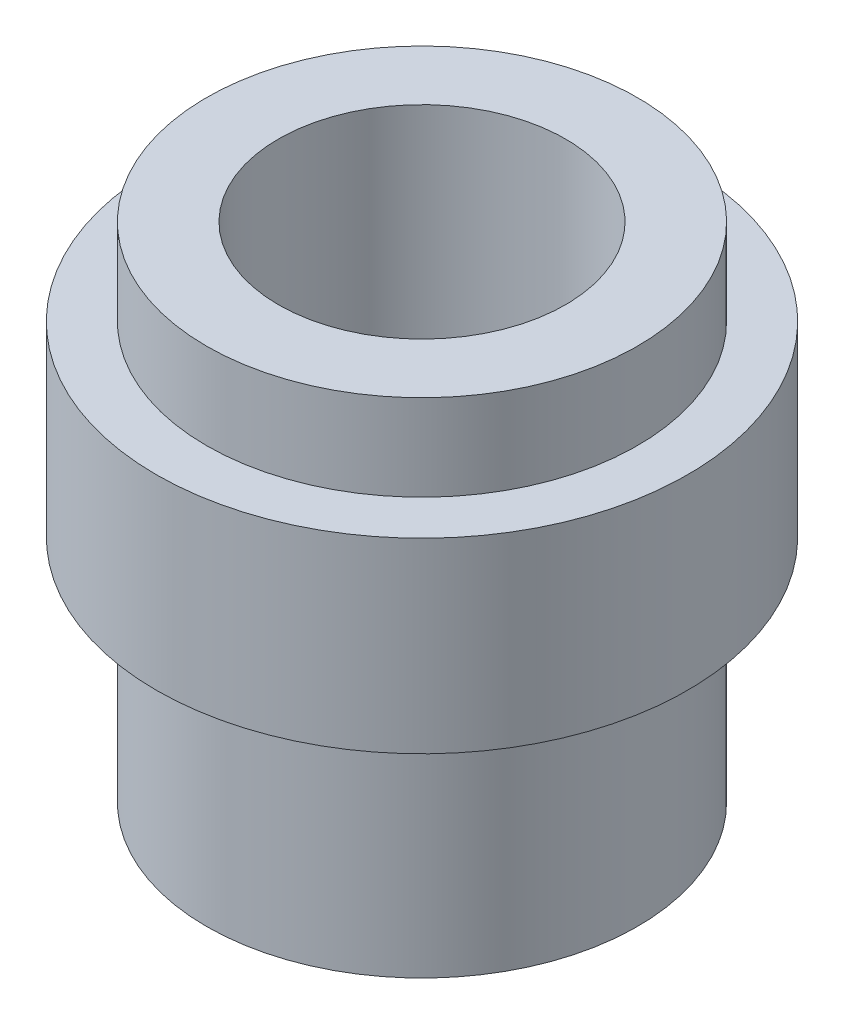
ISO-10303-21;
HEADER;
FILE_DESCRIPTION(('STEP AP214'),'2;1');
FILE_NAME('part.step','',(''),(''),'','','');
FILE_SCHEMA(('AUTOMOTIVE_DESIGN { 1 0 10303 214 1 1 1 1 }'));
ENDSEC;
DATA;
#1=APPLICATION_CONTEXT('core data for automotive mechanical design processes');
#2=APPLICATION_PROTOCOL_DEFINITION('international standard','automotive_design',2000,#1);
#3=PRODUCT_CONTEXT('',#1,'mechanical');
#4=PRODUCT('Part','Part','',(#3));
#5=PRODUCT_RELATED_PRODUCT_CATEGORY('part','',(#4));
#6=PRODUCT_DEFINITION_FORMATION('','',#4);
#7=PRODUCT_DEFINITION_CONTEXT('part definition',#1,'design');
#8=PRODUCT_DEFINITION('design','',#6,#7);
#9=PRODUCT_DEFINITION_SHAPE('','',#8);
#10=(LENGTH_UNIT() NAMED_UNIT(*) SI_UNIT(.MILLI.,.METRE.));
#11=(NAMED_UNIT(*) PLANE_ANGLE_UNIT() SI_UNIT($,.RADIAN.));
#12=(NAMED_UNIT(*) SI_UNIT($,.STERADIAN.) SOLID_ANGLE_UNIT());
#13=UNCERTAINTY_MEASURE_WITH_UNIT(LENGTH_MEASURE(1.E-05),#10,'distance_accuracy_value','');
#14=(GEOMETRIC_REPRESENTATION_CONTEXT(3) GLOBAL_UNCERTAINTY_ASSIGNED_CONTEXT((#13)) GLOBAL_UNIT_ASSIGNED_CONTEXT((#10,
#11,#12)) REPRESENTATION_CONTEXT('',''));
#15=CARTESIAN_POINT('',(0.,0.,0.));
#16=DIRECTION('',(0.,0.,1.));
#17=DIRECTION('',(1.,0.,0.));
#18=AXIS2_PLACEMENT_3D('',#15,#16,#17);
#19=CARTESIAN_POINT('',(0.,37.5814136887096,0.));
#20=DIRECTION('',(0.,-1.,0.));
#21=DIRECTION('',(0.,0.,-1.));
#22=AXIS2_PLACEMENT_3D('',#19,#20,#21);
#23=PLANE('',#22);
#24=CARTESIAN_POINT('',(0.,37.5814136887096,0.));
#25=DIRECTION('',(0.,1.,0.));
#26=DIRECTION('',(0.,0.,1.));
#27=AXIS2_PLACEMENT_3D('',#24,#25,#26);
#28=CIRCLE('',#27,10.);
#29=CARTESIAN_POINT('',(0.,37.5814136887096,10.));
#30=VERTEX_POINT('',#29);
#31=EDGE_CURVE('E56',#30,#30,#28,.T.);
#32=ORIENTED_EDGE('',*,*,#31,.F.);
#33=EDGE_LOOP('',(#32));
#34=FACE_BOUND('',#33,.T.);
#35=CARTESIAN_POINT('',(0.,37.5814136887096,0.));
#36=DIRECTION('',(0.,1.,0.));
#37=DIRECTION('',(0.,0.,1.));
#38=AXIS2_PLACEMENT_3D('',#35,#36,#37);
#39=CIRCLE('',#38,15.);
#40=CARTESIAN_POINT('',(0.,37.5814136887096,15.));
#41=VERTEX_POINT('',#40);
#42=EDGE_CURVE('E10',#41,#41,#39,.T.);
#43=ORIENTED_EDGE('',*,*,#42,.T.);
#44=EDGE_LOOP('',(#43));
#45=FACE_BOUND('',#44,.T.);
#46=ADVANCED_FACE('F31',(#34,#45),#23,.F.);
#47=CARTESIAN_POINT('',(0.,46.5033776301218,0.));
#48=DIRECTION('',(0.,1.,0.));
#49=DIRECTION('',(0.,0.,1.));
#50=AXIS2_PLACEMENT_3D('',#47,#48,#49);
#51=CYLINDRICAL_SURFACE('',#50,15.);
#52=ORIENTED_EDGE('',*,*,#42,.F.);
#53=EDGE_LOOP('',(#52));
#54=FACE_BOUND('',#53,.T.);
#55=CARTESIAN_POINT('',(0.,31.5814136887096,0.));
#56=DIRECTION('',(0.,1.,0.));
#57=DIRECTION('',(0.,0.,1.));
#58=AXIS2_PLACEMENT_3D('',#55,#56,#57);
#59=CIRCLE('',#58,15.);
#60=CARTESIAN_POINT('',(0.,31.5814136887096,15.));
#61=VERTEX_POINT('',#60);
#62=EDGE_CURVE('E38',#61,#61,#59,.T.);
#63=ORIENTED_EDGE('',*,*,#62,.T.);
#64=EDGE_LOOP('',(#63));
#65=FACE_BOUND('',#64,.T.);
#66=ADVANCED_FACE('F75',(#54,#65),#51,.T.);
#67=CARTESIAN_POINT('',(15.,31.5814136887096,0.));
#68=DIRECTION('',(0.,-1.,0.));
#69=DIRECTION('',(0.,0.,-1.));
#70=AXIS2_PLACEMENT_3D('',#67,#68,#69);
#71=PLANE('',#70);
#72=ORIENTED_EDGE('',*,*,#62,.F.);
#73=EDGE_LOOP('',(#72));
#74=FACE_BOUND('',#73,.T.);
#75=CARTESIAN_POINT('',(0.,31.5814136887096,0.));
#76=DIRECTION('',(0.,1.,0.));
#77=DIRECTION('',(0.,0.,1.));
#78=AXIS2_PLACEMENT_3D('',#75,#76,#77);
#79=CIRCLE('',#78,18.5);
#80=CARTESIAN_POINT('',(0.,31.5814136887096,18.5));
#81=VERTEX_POINT('',#80);
#82=EDGE_CURVE('E42',#81,#81,#79,.T.);
#83=ORIENTED_EDGE('',*,*,#82,.T.);
#84=EDGE_LOOP('',(#83));
#85=FACE_BOUND('',#84,.T.);
#86=ADVANCED_FACE('F80',(#74,#85),#71,.F.);
#87=CARTESIAN_POINT('',(0.,46.5033776301218,0.));
#88=DIRECTION('',(0.,1.,0.));
#89=DIRECTION('',(0.,0.,1.));
#90=AXIS2_PLACEMENT_3D('',#87,#88,#89);
#91=CYLINDRICAL_SURFACE('',#90,18.5);
#92=ORIENTED_EDGE('',*,*,#82,.F.);
#93=EDGE_LOOP('',(#92));
#94=FACE_BOUND('',#93,.T.);
#95=CARTESIAN_POINT('',(0.,18.5814136887096,0.));
#96=DIRECTION('',(0.,1.,0.));
#97=DIRECTION('',(0.,0.,1.));
#98=AXIS2_PLACEMENT_3D('',#95,#96,#97);
#99=CIRCLE('',#98,18.5);
#100=CARTESIAN_POINT('',(0.,18.5814136887096,18.5));
#101=VERTEX_POINT('',#100);
#102=EDGE_CURVE('E47',#101,#101,#99,.T.);
#103=ORIENTED_EDGE('',*,*,#102,.T.);
#104=EDGE_LOOP('',(#103));
#105=FACE_BOUND('',#104,.T.);
#106=ADVANCED_FACE('F85',(#94,#105),#91,.T.);
#107=CARTESIAN_POINT('',(18.5,18.5814136887096,0.));
#108=DIRECTION('',(0.,1.,0.));
#109=DIRECTION('',(0.,0.,1.));
#110=AXIS2_PLACEMENT_3D('',#107,#108,#109);
#111=PLANE('',#110);
#112=ORIENTED_EDGE('',*,*,#102,.F.);
#113=EDGE_LOOP('',(#112));
#114=FACE_BOUND('',#113,.T.);
#115=CARTESIAN_POINT('',(0.,18.5814136887096,0.));
#116=DIRECTION('',(0.,1.,0.));
#117=DIRECTION('',(0.,0.,1.));
#118=AXIS2_PLACEMENT_3D('',#115,#116,#117);
#119=CIRCLE('',#118,15.);
#120=CARTESIAN_POINT('',(0.,18.5814136887096,15.));
#121=VERTEX_POINT('',#120);
#122=EDGE_CURVE('E50',#121,#121,#119,.T.);
#123=ORIENTED_EDGE('',*,*,#122,.T.);
#124=EDGE_LOOP('',(#123));
#125=FACE_BOUND('',#124,.T.);
#126=ADVANCED_FACE('F92',(#114,#125),#111,.F.);
#127=CARTESIAN_POINT('',(0.,46.5033776301218,0.));
#128=DIRECTION('',(0.,1.,0.));
#129=DIRECTION('',(0.,0.,1.));
#130=AXIS2_PLACEMENT_3D('',#127,#128,#129);
#131=CYLINDRICAL_SURFACE('',#130,15.);
#132=ORIENTED_EDGE('',*,*,#122,.F.);
#133=EDGE_LOOP('',(#132));
#134=FACE_BOUND('',#133,.T.);
#135=CARTESIAN_POINT('',(0.,2.5814136887096,0.));
#136=DIRECTION('',(0.,1.,0.));
#137=DIRECTION('',(0.,0.,1.));
#138=AXIS2_PLACEMENT_3D('',#135,#136,#137);
#139=CIRCLE('',#138,15.);
#140=CARTESIAN_POINT('',(0.,2.5814136887096,15.));
#141=VERTEX_POINT('',#140);
#142=EDGE_CURVE('E53',#141,#141,#139,.T.);
#143=ORIENTED_EDGE('',*,*,#142,.T.);
#144=EDGE_LOOP('',(#143));
#145=FACE_BOUND('',#144,.T.);
#146=ADVANCED_FACE('F72',(#134,#145),#131,.T.);
#147=CARTESIAN_POINT('',(15.,2.5814136887096,0.));
#148=DIRECTION('',(0.,1.,0.));
#149=DIRECTION('',(0.,0.,1.));
#150=AXIS2_PLACEMENT_3D('',#147,#148,#149);
#151=PLANE('',#150);
#152=CARTESIAN_POINT('',(0.,2.5814136887096,0.));
#153=DIRECTION('',(0.,1.,0.));
#154=DIRECTION('',(0.,0.,1.));
#155=AXIS2_PLACEMENT_3D('',#152,#153,#154);
#156=CIRCLE('',#155,10.);
#157=CARTESIAN_POINT('',(0.,2.5814136887096,10.));
#158=VERTEX_POINT('',#157);
#159=EDGE_CURVE('E34',#158,#158,#156,.T.);
#160=ORIENTED_EDGE('',*,*,#159,.T.);
#161=EDGE_LOOP('',(#160));
#162=FACE_BOUND('',#161,.T.);
#163=ORIENTED_EDGE('',*,*,#142,.F.);
#164=EDGE_LOOP('',(#163));
#165=FACE_BOUND('',#164,.T.);
#166=ADVANCED_FACE('F63',(#162,#165),#151,.F.);
#167=CARTESIAN_POINT('',(0.,-7.41858631129041,0.));
#168=DIRECTION('',(0.,1.,0.));
#169=DIRECTION('',(0.,0.,1.));
#170=AXIS2_PLACEMENT_3D('',#167,#168,#169);
#171=CYLINDRICAL_SURFACE('',#170,10.);
#172=ORIENTED_EDGE('',*,*,#31,.T.);
#173=EDGE_LOOP('',(#172));
#174=FACE_BOUND('',#173,.T.);
#175=ORIENTED_EDGE('',*,*,#159,.F.);
#176=EDGE_LOOP('',(#175));
#177=FACE_BOUND('',#176,.T.);
#178=ADVANCED_FACE('F66',(#174,#177),#171,.F.);
#179=CLOSED_SHELL('',(#46,#66,#86,#106,#126,#146,#166,#178));
#180=MANIFOLD_SOLID_BREP('B2',#179);
#181=ADVANCED_BREP_SHAPE_REPRESENTATION('',(#18,#180),#14);
#182=SHAPE_DEFINITION_REPRESENTATION(#9,#181);
ENDSEC;
END-ISO-10303-21;
